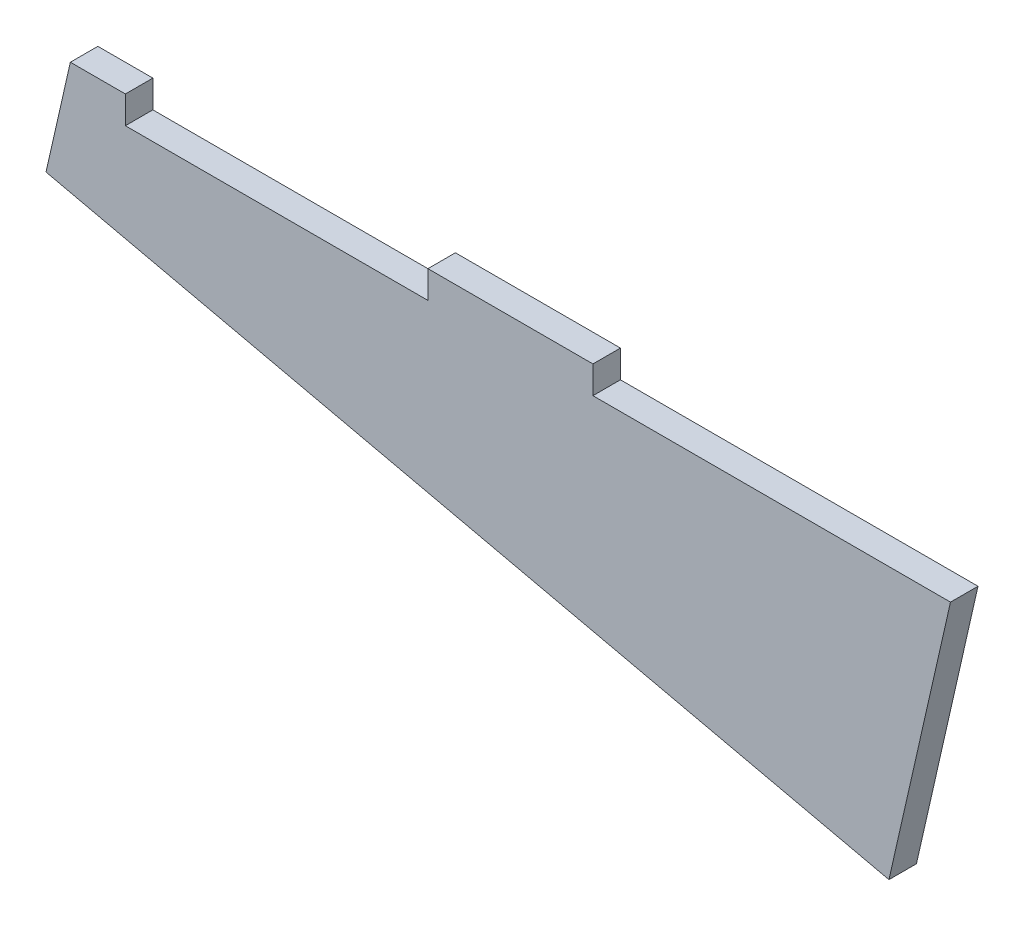
ISO-10303-21;
HEADER;
FILE_DESCRIPTION(('STEP AP214'),'2;1');
FILE_NAME('part.step','',(''),(''),'','','');
FILE_SCHEMA(('AUTOMOTIVE_DESIGN { 1 0 10303 214 1 1 1 1 }'));
ENDSEC;
DATA;
#1=APPLICATION_CONTEXT('core data for automotive mechanical design processes');
#2=APPLICATION_PROTOCOL_DEFINITION('international standard','automotive_design',2000,#1);
#3=PRODUCT_CONTEXT('',#1,'mechanical');
#4=PRODUCT('Part','Part','',(#3));
#5=PRODUCT_RELATED_PRODUCT_CATEGORY('part','',(#4));
#6=PRODUCT_DEFINITION_FORMATION('','',#4);
#7=PRODUCT_DEFINITION_CONTEXT('part definition',#1,'design');
#8=PRODUCT_DEFINITION('design','',#6,#7);
#9=PRODUCT_DEFINITION_SHAPE('','',#8);
#10=(LENGTH_UNIT() NAMED_UNIT(*) SI_UNIT(.MILLI.,.METRE.));
#11=(NAMED_UNIT(*) PLANE_ANGLE_UNIT() SI_UNIT($,.RADIAN.));
#12=(NAMED_UNIT(*) SI_UNIT($,.STERADIAN.) SOLID_ANGLE_UNIT());
#13=UNCERTAINTY_MEASURE_WITH_UNIT(LENGTH_MEASURE(1.E-05),#10,'distance_accuracy_value','');
#14=(GEOMETRIC_REPRESENTATION_CONTEXT(3) GLOBAL_UNCERTAINTY_ASSIGNED_CONTEXT((#13)) GLOBAL_UNIT_ASSIGNED_CONTEXT((#10,
#11,#12)) REPRESENTATION_CONTEXT('',''));
#15=CARTESIAN_POINT('',(0.,0.,0.));
#16=DIRECTION('',(0.,0.,1.));
#17=DIRECTION('',(1.,0.,0.));
#18=AXIS2_PLACEMENT_3D('',#15,#16,#17);
#19=CARTESIAN_POINT('',(-192.074475733538,-68.364325776019,-6.35));
#20=DIRECTION('',(-0.975188006960356,0.221378298576641,0.));
#21=DIRECTION('',(-0.221378298576641,-0.975188006960356,0.));
#22=AXIS2_PLACEMENT_3D('',#19,#20,#21);
#23=PLANE('',#22);
#24=DIRECTION('',(-0.221378298576641,-0.975188006960356,0.));
#25=VECTOR('',#24,1.);
#26=CARTESIAN_POINT('',(-192.074475733538,-68.364325776019,0.));
#27=LINE('',#26,#25);
#28=CARTESIAN_POINT('',(-186.451466949691,-43.5945503992259,0.));
#29=VERTEX_POINT('',#28);
#30=CARTESIAN_POINT('',(-192.074475733538,-68.364325776019,0.));
#31=VERTEX_POINT('',#30);
#32=EDGE_CURVE('E148',#29,#31,#27,.T.);
#33=ORIENTED_EDGE('',*,*,#32,.F.);
#34=DIRECTION('',(0.,0.,1.));
#35=VECTOR('',#34,1.);
#36=CARTESIAN_POINT('',(-186.451466949691,-43.5945503992259,-6.35));
#37=LINE('',#36,#35);
#38=CARTESIAN_POINT('',(-186.451466949691,-43.5945503992259,-6.35));
#39=VERTEX_POINT('',#38);
#40=EDGE_CURVE('E11',#39,#29,#37,.T.);
#41=ORIENTED_EDGE('',*,*,#40,.F.);
#42=DIRECTION('',(-0.221378298576641,-0.975188006960356,0.));
#43=VECTOR('',#42,1.);
#44=CARTESIAN_POINT('',(-192.074475733538,-68.364325776019,-6.35));
#45=LINE('',#44,#43);
#46=CARTESIAN_POINT('',(-192.074475733538,-68.364325776019,-6.35));
#47=VERTEX_POINT('',#46);
#48=EDGE_CURVE('E174',#39,#47,#45,.T.);
#49=ORIENTED_EDGE('',*,*,#48,.T.);
#50=DIRECTION('',(0.,0.,1.));
#51=VECTOR('',#50,1.);
#52=CARTESIAN_POINT('',(-192.074475733538,-68.364325776019,-6.35));
#53=LINE('',#52,#51);
#54=EDGE_CURVE('E42',#47,#31,#53,.T.);
#55=ORIENTED_EDGE('',*,*,#54,.T.);
#56=EDGE_LOOP('',(#33,#41,#49,#55));
#57=FACE_BOUND('',#56,.T.);
#58=ADVANCED_FACE('F39',(#57),#23,.T.);
#59=CARTESIAN_POINT('',(-186.451466949691,-43.5945503992259,-6.35));
#60=DIRECTION('',(0.,1.,0.));
#61=DIRECTION('',(0.,0.,1.));
#62=AXIS2_PLACEMENT_3D('',#59,#60,#61);
#63=PLANE('',#62);
#64=DIRECTION('',(-1.,0.,0.));
#65=VECTOR('',#64,1.);
#66=CARTESIAN_POINT('',(-186.451466949691,-43.5945503992259,0.));
#67=LINE('',#66,#65);
#68=CARTESIAN_POINT('',(-173.751466949691,-43.5945503992259,0.));
#69=VERTEX_POINT('',#68);
#70=EDGE_CURVE('E172',#69,#29,#67,.T.);
#71=ORIENTED_EDGE('',*,*,#70,.F.);
#72=DIRECTION('',(0.,0.,1.));
#73=VECTOR('',#72,1.);
#74=CARTESIAN_POINT('',(-173.751466949691,-43.5945503992259,-6.35));
#75=LINE('',#74,#73);
#76=CARTESIAN_POINT('',(-173.751466949691,-43.5945503992259,-6.35));
#77=VERTEX_POINT('',#76);
#78=EDGE_CURVE('E48',#77,#69,#75,.T.);
#79=ORIENTED_EDGE('',*,*,#78,.F.);
#80=DIRECTION('',(-1.,0.,0.));
#81=VECTOR('',#80,1.);
#82=CARTESIAN_POINT('',(-186.451466949691,-43.5945503992259,-6.35));
#83=LINE('',#82,#81);
#84=EDGE_CURVE('E138',#77,#39,#83,.T.);
#85=ORIENTED_EDGE('',*,*,#84,.T.);
#86=ORIENTED_EDGE('',*,*,#40,.T.);
#87=EDGE_LOOP('',(#71,#79,#85,#86));
#88=FACE_BOUND('',#87,.T.);
#89=ADVANCED_FACE('F190',(#88),#63,.T.);
#90=CARTESIAN_POINT('',(-173.751466949691,-43.5945503992259,-6.35));
#91=DIRECTION('',(1.,0.,0.));
#92=DIRECTION('',(0.,0.,-1.));
#93=AXIS2_PLACEMENT_3D('',#90,#91,#92);
#94=PLANE('',#93);
#95=DIRECTION('',(0.,1.,0.));
#96=VECTOR('',#95,1.);
#97=CARTESIAN_POINT('',(-173.751466949691,-43.5945503992259,0.));
#98=LINE('',#97,#96);
#99=CARTESIAN_POINT('',(-173.751466949691,-49.9445503992259,0.));
#100=VERTEX_POINT('',#99);
#101=EDGE_CURVE('E125',#100,#69,#98,.T.);
#102=ORIENTED_EDGE('',*,*,#101,.F.);
#103=DIRECTION('',(0.,0.,1.));
#104=VECTOR('',#103,1.);
#105=CARTESIAN_POINT('',(-173.751466949691,-49.9445503992259,-6.35));
#106=LINE('',#105,#104);
#107=CARTESIAN_POINT('',(-173.751466949691,-49.9445503992259,-6.35));
#108=VERTEX_POINT('',#107);
#109=EDGE_CURVE('E120',#108,#100,#106,.T.);
#110=ORIENTED_EDGE('',*,*,#109,.F.);
#111=DIRECTION('',(0.,1.,0.));
#112=VECTOR('',#111,1.);
#113=CARTESIAN_POINT('',(-173.751466949691,-43.5945503992259,-6.35));
#114=LINE('',#113,#112);
#115=EDGE_CURVE('E123',#108,#77,#114,.T.);
#116=ORIENTED_EDGE('',*,*,#115,.T.);
#117=ORIENTED_EDGE('',*,*,#78,.T.);
#118=EDGE_LOOP('',(#102,#110,#116,#117));
#119=FACE_BOUND('',#118,.T.);
#120=ADVANCED_FACE('F122',(#119),#94,.T.);
#121=CARTESIAN_POINT('',(-173.751466949691,-49.9445503992259,-6.35));
#122=DIRECTION('',(0.,1.,0.));
#123=DIRECTION('',(-1.,0.,0.));
#124=AXIS2_PLACEMENT_3D('',#121,#122,#123);
#125=PLANE('',#124);
#126=DIRECTION('',(-1.,0.,0.));
#127=VECTOR('',#126,1.);
#128=CARTESIAN_POINT('',(-173.751466949691,-49.9445503992259,0.));
#129=LINE('',#128,#127);
#130=CARTESIAN_POINT('',(-103.901466949691,-49.944550399226,0.));
#131=VERTEX_POINT('',#130);
#132=EDGE_CURVE('E169',#131,#100,#129,.T.);
#133=ORIENTED_EDGE('',*,*,#132,.F.);
#134=DIRECTION('',(0.,0.,1.));
#135=VECTOR('',#134,1.);
#136=CARTESIAN_POINT('',(-103.901466949691,-49.944550399226,-6.35));
#137=LINE('',#136,#135);
#138=CARTESIAN_POINT('',(-103.901466949691,-49.944550399226,-6.35));
#139=VERTEX_POINT('',#138);
#140=EDGE_CURVE('E130',#139,#131,#137,.T.);
#141=ORIENTED_EDGE('',*,*,#140,.F.);
#142=DIRECTION('',(-1.,0.,0.));
#143=VECTOR('',#142,1.);
#144=CARTESIAN_POINT('',(-173.751466949691,-49.9445503992259,-6.35));
#145=LINE('',#144,#143);
#146=EDGE_CURVE('E136',#139,#108,#145,.T.);
#147=ORIENTED_EDGE('',*,*,#146,.T.);
#148=ORIENTED_EDGE('',*,*,#109,.T.);
#149=EDGE_LOOP('',(#133,#141,#147,#148));
#150=FACE_BOUND('',#149,.T.);
#151=ADVANCED_FACE('F140',(#150),#125,.T.);
#152=CARTESIAN_POINT('',(-103.901466949691,-49.944550399226,-6.35));
#153=DIRECTION('',(-1.,0.,0.));
#154=DIRECTION('',(0.,0.,1.));
#155=AXIS2_PLACEMENT_3D('',#152,#153,#154);
#156=PLANE('',#155);
#157=DIRECTION('',(0.,-1.,0.));
#158=VECTOR('',#157,1.);
#159=CARTESIAN_POINT('',(-103.901466949691,-49.944550399226,0.));
#160=LINE('',#159,#158);
#161=CARTESIAN_POINT('',(-103.901466949691,-43.5945503992259,0.));
#162=VERTEX_POINT('',#161);
#163=EDGE_CURVE('E166',#162,#131,#160,.T.);
#164=ORIENTED_EDGE('',*,*,#163,.F.);
#165=DIRECTION('',(0.,0.,1.));
#166=VECTOR('',#165,1.);
#167=CARTESIAN_POINT('',(-103.901466949691,-43.5945503992259,-6.35));
#168=LINE('',#167,#166);
#169=CARTESIAN_POINT('',(-103.901466949691,-43.5945503992259,-6.35));
#170=VERTEX_POINT('',#169);
#171=EDGE_CURVE('E178',#170,#162,#168,.T.);
#172=ORIENTED_EDGE('',*,*,#171,.F.);
#173=DIRECTION('',(0.,-1.,0.));
#174=VECTOR('',#173,1.);
#175=CARTESIAN_POINT('',(-103.901466949691,-49.944550399226,-6.35));
#176=LINE('',#175,#174);
#177=EDGE_CURVE('E141',#170,#139,#176,.T.);
#178=ORIENTED_EDGE('',*,*,#177,.T.);
#179=ORIENTED_EDGE('',*,*,#140,.T.);
#180=EDGE_LOOP('',(#164,#172,#178,#179));
#181=FACE_BOUND('',#180,.T.);
#182=ADVANCED_FACE('F203',(#181),#156,.T.);
#183=CARTESIAN_POINT('',(-103.901466949691,-43.5945503992259,-6.35));
#184=DIRECTION('',(0.,1.,0.));
#185=DIRECTION('',(0.,0.,1.));
#186=AXIS2_PLACEMENT_3D('',#183,#184,#185);
#187=PLANE('',#186);
#188=DIRECTION('',(-1.,0.,0.));
#189=VECTOR('',#188,1.);
#190=CARTESIAN_POINT('',(-103.901466949691,-43.5945503992259,0.));
#191=LINE('',#190,#189);
#192=CARTESIAN_POINT('',(-65.8014669496914,-43.5945503992259,0.));
#193=VERTEX_POINT('',#192);
#194=EDGE_CURVE('E163',#193,#162,#191,.T.);
#195=ORIENTED_EDGE('',*,*,#194,.F.);
#196=DIRECTION('',(0.,0.,1.));
#197=VECTOR('',#196,1.);
#198=CARTESIAN_POINT('',(-65.8014669496914,-43.5945503992259,-6.35));
#199=LINE('',#198,#197);
#200=CARTESIAN_POINT('',(-65.8014669496914,-43.5945503992259,-6.35));
#201=VERTEX_POINT('',#200);
#202=EDGE_CURVE('E180',#201,#193,#199,.T.);
#203=ORIENTED_EDGE('',*,*,#202,.F.);
#204=DIRECTION('',(-1.,0.,0.));
#205=VECTOR('',#204,1.);
#206=CARTESIAN_POINT('',(-103.901466949691,-43.5945503992259,-6.35));
#207=LINE('',#206,#205);
#208=EDGE_CURVE('E143',#201,#170,#207,.T.);
#209=ORIENTED_EDGE('',*,*,#208,.T.);
#210=ORIENTED_EDGE('',*,*,#171,.T.);
#211=EDGE_LOOP('',(#195,#203,#209,#210));
#212=FACE_BOUND('',#211,.T.);
#213=ADVANCED_FACE('F206',(#212),#187,.T.);
#214=CARTESIAN_POINT('',(-65.8014669496914,-43.5945503992259,-6.35));
#215=DIRECTION('',(1.,0.,0.));
#216=DIRECTION('',(0.,0.,-1.));
#217=AXIS2_PLACEMENT_3D('',#214,#215,#216);
#218=PLANE('',#217);
#219=DIRECTION('',(0.,1.,0.));
#220=VECTOR('',#219,1.);
#221=CARTESIAN_POINT('',(-65.8014669496914,-43.5945503992259,0.));
#222=LINE('',#221,#220);
#223=CARTESIAN_POINT('',(-65.8014669496914,-49.9445503992259,0.));
#224=VERTEX_POINT('',#223);
#225=EDGE_CURVE('E160',#224,#193,#222,.T.);
#226=ORIENTED_EDGE('',*,*,#225,.F.);
#227=DIRECTION('',(0.,0.,1.));
#228=VECTOR('',#227,1.);
#229=CARTESIAN_POINT('',(-65.8014669496914,-49.9445503992259,-6.35));
#230=LINE('',#229,#228);
#231=CARTESIAN_POINT('',(-65.8014669496914,-49.9445503992259,-6.35));
#232=VERTEX_POINT('',#231);
#233=EDGE_CURVE('E182',#232,#224,#230,.T.);
#234=ORIENTED_EDGE('',*,*,#233,.F.);
#235=DIRECTION('',(0.,1.,0.));
#236=VECTOR('',#235,1.);
#237=CARTESIAN_POINT('',(-65.8014669496914,-43.5945503992259,-6.35));
#238=LINE('',#237,#236);
#239=EDGE_CURVE('E305',#232,#201,#238,.T.);
#240=ORIENTED_EDGE('',*,*,#239,.T.);
#241=ORIENTED_EDGE('',*,*,#202,.T.);
#242=EDGE_LOOP('',(#226,#234,#240,#241));
#243=FACE_BOUND('',#242,.T.);
#244=ADVANCED_FACE('F210',(#243),#218,.T.);
#245=CARTESIAN_POINT('',(-65.8014669496914,-49.9445503992259,-6.35));
#246=DIRECTION('',(0.,1.,0.));
#247=DIRECTION('',(0.,0.,1.));
#248=AXIS2_PLACEMENT_3D('',#245,#246,#247);
#249=PLANE('',#248);
#250=DIRECTION('',(-1.,0.,0.));
#251=VECTOR('',#250,1.);
#252=CARTESIAN_POINT('',(-65.8014669496914,-49.9445503992259,0.));
#253=LINE('',#252,#251);
#254=CARTESIAN_POINT('',(16.7485330503086,-49.9445503992259,0.));
#255=VERTEX_POINT('',#254);
#256=EDGE_CURVE('E157',#255,#224,#253,.T.);
#257=ORIENTED_EDGE('',*,*,#256,.F.);
#258=DIRECTION('',(0.,0.,1.));
#259=VECTOR('',#258,1.);
#260=CARTESIAN_POINT('',(16.7485330503086,-49.9445503992259,-6.35));
#261=LINE('',#260,#259);
#262=CARTESIAN_POINT('',(16.7485330503086,-49.9445503992259,-6.35));
#263=VERTEX_POINT('',#262);
#264=EDGE_CURVE('E184',#263,#255,#261,.T.);
#265=ORIENTED_EDGE('',*,*,#264,.F.);
#266=DIRECTION('',(-1.,0.,0.));
#267=VECTOR('',#266,1.);
#268=CARTESIAN_POINT('',(-65.8014669496914,-49.9445503992259,-6.35));
#269=LINE('',#268,#267);
#270=EDGE_CURVE('E301',#263,#232,#269,.T.);
#271=ORIENTED_EDGE('',*,*,#270,.T.);
#272=ORIENTED_EDGE('',*,*,#233,.T.);
#273=EDGE_LOOP('',(#257,#265,#271,#272));
#274=FACE_BOUND('',#273,.T.);
#275=ADVANCED_FACE('F214',(#274),#249,.T.);
#276=CARTESIAN_POINT('',(16.7485330503086,-49.9445503992259,-6.35));
#277=DIRECTION('',(0.975188006960356,-0.221378298576642,0.));
#278=DIRECTION('',(0.221378298576642,0.975188006960356,0.));
#279=AXIS2_PLACEMENT_3D('',#276,#277,#278);
#280=PLANE('',#279);
#281=DIRECTION('',(0.221378298576642,0.975188006960356,0.));
#282=VECTOR('',#281,1.);
#283=CARTESIAN_POINT('',(16.7485330503086,-49.9445503992259,0.));
#284=LINE('',#283,#282);
#285=CARTESIAN_POINT('',(2.53790000912596,-112.543454637702,0.));
#286=VERTEX_POINT('',#285);
#287=EDGE_CURVE('E154',#286,#255,#284,.T.);
#288=ORIENTED_EDGE('',*,*,#287,.F.);
#289=DIRECTION('',(0.,0.,1.));
#290=VECTOR('',#289,1.);
#291=CARTESIAN_POINT('',(2.53790000912596,-112.543454637702,-6.35));
#292=LINE('',#291,#290);
#293=CARTESIAN_POINT('',(2.53790000912596,-112.543454637702,-6.35));
#294=VERTEX_POINT('',#293);
#295=EDGE_CURVE('E185',#294,#286,#292,.T.);
#296=ORIENTED_EDGE('',*,*,#295,.F.);
#297=DIRECTION('',(0.221378298576642,0.975188006960356,0.));
#298=VECTOR('',#297,1.);
#299=CARTESIAN_POINT('',(16.7485330503086,-49.9445503992259,-6.35));
#300=LINE('',#299,#298);
#301=EDGE_CURVE('E312',#294,#263,#300,.T.);
#302=ORIENTED_EDGE('',*,*,#301,.T.);
#303=ORIENTED_EDGE('',*,*,#264,.T.);
#304=EDGE_LOOP('',(#288,#296,#302,#303));
#305=FACE_BOUND('',#304,.T.);
#306=ADVANCED_FACE('F218',(#305),#280,.T.);
#307=CARTESIAN_POINT('',(2.53790000912596,-112.543454637702,-6.35));
#308=DIRECTION('',(-0.221378298576642,-0.975188006960356,0.));
#309=DIRECTION('',(0.975188006960356,-0.221378298576642,0.));
#310=AXIS2_PLACEMENT_3D('',#307,#308,#309);
#311=PLANE('',#310);
#312=DIRECTION('',(0.975188006960356,-0.221378298576642,0.));
#313=VECTOR('',#312,1.);
#314=CARTESIAN_POINT('',(2.53790000912596,-112.543454637702,0.));
#315=LINE('',#314,#313);
#316=EDGE_CURVE('E151',#31,#286,#315,.T.);
#317=ORIENTED_EDGE('',*,*,#316,.F.);
#318=ORIENTED_EDGE('',*,*,#54,.F.);
#319=DIRECTION('',(0.975188006960356,-0.221378298576642,0.));
#320=VECTOR('',#319,1.);
#321=CARTESIAN_POINT('',(2.53790000912596,-112.543454637702,-6.35));
#322=LINE('',#321,#320);
#323=EDGE_CURVE('E314',#47,#294,#322,.T.);
#324=ORIENTED_EDGE('',*,*,#323,.T.);
#325=ORIENTED_EDGE('',*,*,#295,.T.);
#326=EDGE_LOOP('',(#317,#318,#324,#325));
#327=FACE_BOUND('',#326,.T.);
#328=ADVANCED_FACE('F187',(#327),#311,.T.);
#329=CARTESIAN_POINT('',(0.,0.,-6.35));
#330=DIRECTION('',(0.,0.,1.));
#331=DIRECTION('',(1.,0.,0.));
#332=AXIS2_PLACEMENT_3D('',#329,#330,#331);
#333=PLANE('',#332);
#334=ORIENTED_EDGE('',*,*,#48,.F.);
#335=ORIENTED_EDGE('',*,*,#84,.F.);
#336=ORIENTED_EDGE('',*,*,#115,.F.);
#337=ORIENTED_EDGE('',*,*,#146,.F.);
#338=ORIENTED_EDGE('',*,*,#177,.F.);
#339=ORIENTED_EDGE('',*,*,#208,.F.);
#340=ORIENTED_EDGE('',*,*,#239,.F.);
#341=ORIENTED_EDGE('',*,*,#270,.F.);
#342=ORIENTED_EDGE('',*,*,#301,.F.);
#343=ORIENTED_EDGE('',*,*,#323,.F.);
#344=EDGE_LOOP('',(#334,#335,#336,#337,#338,#339,#340,#341,#342,#343));
#345=FACE_BOUND('',#344,.T.);
#346=ADVANCED_FACE('F134',(#345),#333,.F.);
#347=CARTESIAN_POINT('',(0.,0.,0.));
#348=DIRECTION('',(0.,0.,1.));
#349=DIRECTION('',(1.,0.,0.));
#350=AXIS2_PLACEMENT_3D('',#347,#348,#349);
#351=PLANE('',#350);
#352=ORIENTED_EDGE('',*,*,#32,.T.);
#353=ORIENTED_EDGE('',*,*,#316,.T.);
#354=ORIENTED_EDGE('',*,*,#287,.T.);
#355=ORIENTED_EDGE('',*,*,#256,.T.);
#356=ORIENTED_EDGE('',*,*,#225,.T.);
#357=ORIENTED_EDGE('',*,*,#194,.T.);
#358=ORIENTED_EDGE('',*,*,#163,.T.);
#359=ORIENTED_EDGE('',*,*,#132,.T.);
#360=ORIENTED_EDGE('',*,*,#101,.T.);
#361=ORIENTED_EDGE('',*,*,#70,.T.);
#362=EDGE_LOOP('',(#352,#353,#354,#355,#356,#357,#358,#359,#360,#361));
#363=FACE_BOUND('',#362,.T.);
#364=ADVANCED_FACE('F189',(#363),#351,.T.);
#365=CLOSED_SHELL('',(#58,#89,#120,#151,#182,#213,#244,#275,#306,#328,#346,#364));
#366=MANIFOLD_SOLID_BREP('B2',#365);
#367=ADVANCED_BREP_SHAPE_REPRESENTATION('',(#18,#366),#14);
#368=SHAPE_DEFINITION_REPRESENTATION(#9,#367);
ENDSEC;
END-ISO-10303-21;
